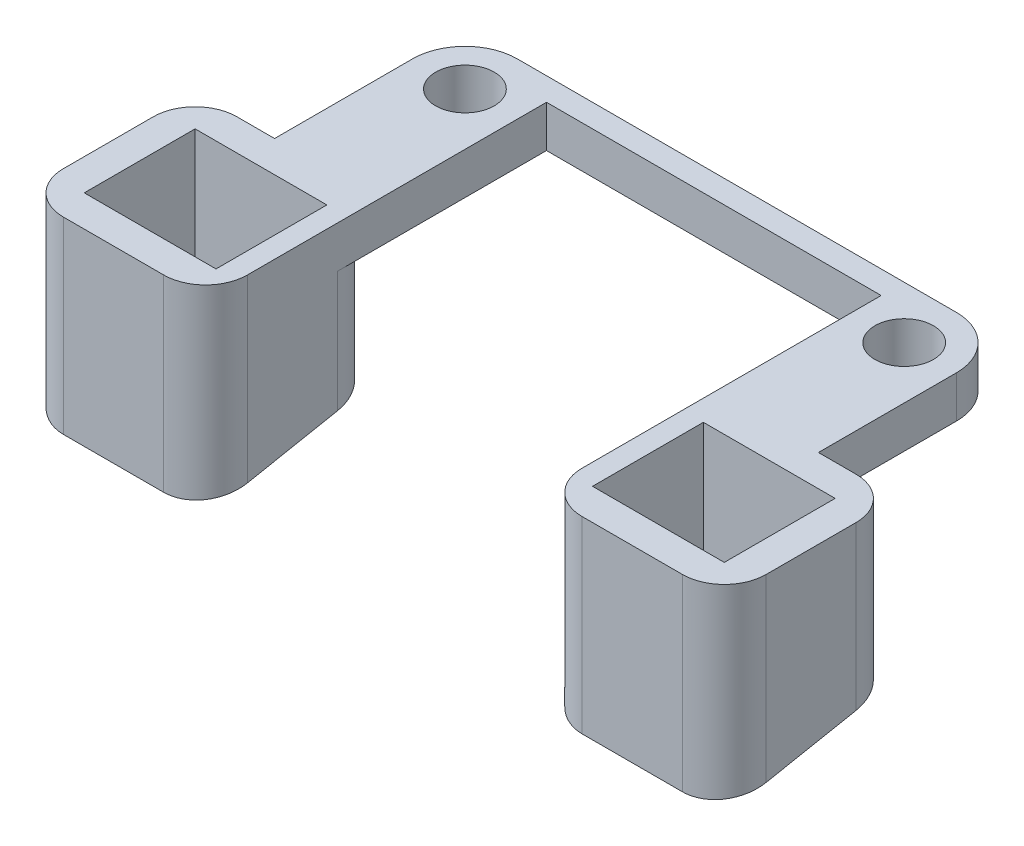
ISO-10303-21;
HEADER;
FILE_DESCRIPTION(('STEP AP214'),'2;1');
FILE_NAME('part.step','',(''),(''),'','','');
FILE_SCHEMA(('AUTOMOTIVE_DESIGN { 1 0 10303 214 1 1 1 1 }'));
ENDSEC;
DATA;
#1=APPLICATION_CONTEXT('core data for automotive mechanical design processes');
#2=APPLICATION_PROTOCOL_DEFINITION('international standard','automotive_design',2000,#1);
#3=PRODUCT_CONTEXT('',#1,'mechanical');
#4=PRODUCT('Part','Part','',(#3));
#5=PRODUCT_RELATED_PRODUCT_CATEGORY('part','',(#4));
#6=PRODUCT_DEFINITION_FORMATION('','',#4);
#7=PRODUCT_DEFINITION_CONTEXT('part definition',#1,'design');
#8=PRODUCT_DEFINITION('design','',#6,#7);
#9=PRODUCT_DEFINITION_SHAPE('','',#8);
#10=(LENGTH_UNIT() NAMED_UNIT(*) SI_UNIT(.MILLI.,.METRE.));
#11=(NAMED_UNIT(*) PLANE_ANGLE_UNIT() SI_UNIT($,.RADIAN.));
#12=(NAMED_UNIT(*) SI_UNIT($,.STERADIAN.) SOLID_ANGLE_UNIT());
#13=UNCERTAINTY_MEASURE_WITH_UNIT(LENGTH_MEASURE(1.E-05),#10,'distance_accuracy_value','');
#14=(GEOMETRIC_REPRESENTATION_CONTEXT(3) GLOBAL_UNCERTAINTY_ASSIGNED_CONTEXT((#13)) GLOBAL_UNIT_ASSIGNED_CONTEXT((#10,
#11,#12)) REPRESENTATION_CONTEXT('',''));
#15=CARTESIAN_POINT('',(0.,0.,0.));
#16=DIRECTION('',(0.,0.,1.));
#17=DIRECTION('',(1.,0.,0.));
#18=AXIS2_PLACEMENT_3D('',#15,#16,#17);
#19=CARTESIAN_POINT('',(13.,2.,0.));
#20=DIRECTION('',(0.,0.,-1.));
#21=DIRECTION('',(-1.,0.,0.));
#22=AXIS2_PLACEMENT_3D('',#19,#20,#21);
#23=PLANE('',#22);
#24=DIRECTION('',(-1.,0.,0.));
#25=VECTOR('',#24,1.);
#26=CARTESIAN_POINT('',(13.,-5.68096385542169,0.));
#27=LINE('',#26,#25);
#28=CARTESIAN_POINT('',(15.3,-5.68096385542169,0.));
#29=VERTEX_POINT('',#28);
#30=CARTESIAN_POINT('',(9.,-5.68096385542169,0.));
#31=VERTEX_POINT('',#30);
#32=EDGE_CURVE('E277',#29,#31,#27,.T.);
#33=ORIENTED_EDGE('',*,*,#32,.F.);
#34=DIRECTION('',(0.,1.,0.));
#35=VECTOR('',#34,1.);
#36=CARTESIAN_POINT('',(15.3,-7.,0.));
#37=LINE('',#36,#35);
#38=CARTESIAN_POINT('',(15.3,2.,0.));
#39=VERTEX_POINT('',#38);
#40=EDGE_CURVE('E431',#29,#39,#37,.T.);
#41=ORIENTED_EDGE('',*,*,#40,.T.);
#42=DIRECTION('',(1.,0.,0.));
#43=VECTOR('',#42,1.);
#44=CARTESIAN_POINT('',(13.,2.,0.));
#45=LINE('',#44,#43);
#46=CARTESIAN_POINT('',(9.,2.,0.));
#47=VERTEX_POINT('',#46);
#48=EDGE_CURVE('E531',#47,#39,#45,.T.);
#49=ORIENTED_EDGE('',*,*,#48,.F.);
#50=DIRECTION('',(0.,1.,0.));
#51=VECTOR('',#50,1.);
#52=CARTESIAN_POINT('',(9.,-7.,0.));
#53=LINE('',#52,#51);
#54=EDGE_CURVE('E262',#31,#47,#53,.T.);
#55=ORIENTED_EDGE('',*,*,#54,.F.);
#56=EDGE_LOOP('',(#33,#41,#49,#55));
#57=FACE_BOUND('',#56,.T.);
#58=ADVANCED_FACE('F39',(#57),#23,.F.);
#59=CARTESIAN_POINT('',(-8.,2.,0.));
#60=DIRECTION('',(0.,0.,-1.));
#61=DIRECTION('',(-1.,0.,0.));
#62=AXIS2_PLACEMENT_3D('',#59,#60,#61);
#63=PLANE('',#62);
#64=DIRECTION('',(-1.,0.,0.));
#65=VECTOR('',#64,1.);
#66=CARTESIAN_POINT('',(-8.,-5.68096385542169,0.));
#67=LINE('',#66,#65);
#68=CARTESIAN_POINT('',(-9.,-5.68096385542169,0.));
#69=VERTEX_POINT('',#68);
#70=CARTESIAN_POINT('',(-15.3,-5.68096385542169,0.));
#71=VERTEX_POINT('',#70);
#72=EDGE_CURVE('E411',#69,#71,#67,.T.);
#73=ORIENTED_EDGE('',*,*,#72,.F.);
#74=DIRECTION('',(0.,1.,0.));
#75=VECTOR('',#74,1.);
#76=CARTESIAN_POINT('',(-9.,-7.,0.));
#77=LINE('',#76,#75);
#78=CARTESIAN_POINT('',(-9.,2.,0.));
#79=VERTEX_POINT('',#78);
#80=EDGE_CURVE('E472',#69,#79,#77,.T.);
#81=ORIENTED_EDGE('',*,*,#80,.T.);
#82=DIRECTION('',(1.,0.,0.));
#83=VECTOR('',#82,1.);
#84=CARTESIAN_POINT('',(-8.,2.,0.));
#85=LINE('',#84,#83);
#86=CARTESIAN_POINT('',(-15.3,2.,0.));
#87=VERTEX_POINT('',#86);
#88=EDGE_CURVE('E516',#87,#79,#85,.T.);
#89=ORIENTED_EDGE('',*,*,#88,.F.);
#90=DIRECTION('',(0.,1.,0.));
#91=VECTOR('',#90,1.);
#92=CARTESIAN_POINT('',(-15.3,-7.,0.));
#93=LINE('',#92,#91);
#94=EDGE_CURVE('E468',#71,#87,#93,.T.);
#95=ORIENTED_EDGE('',*,*,#94,.F.);
#96=EDGE_LOOP('',(#73,#81,#89,#95));
#97=FACE_BOUND('',#96,.T.);
#98=ADVANCED_FACE('F677',(#97),#63,.F.);
#99=CARTESIAN_POINT('',(-8.,2.,-9.5));
#100=DIRECTION('',(-1.,0.,0.));
#101=DIRECTION('',(0.,0.,1.));
#102=AXIS2_PLACEMENT_3D('',#99,#100,#101);
#103=PLANE('',#102);
#104=DIRECTION('',(0.,-0.190426429595575,0.98170146934365));
#105=VECTOR('',#104,1.);
#106=CARTESIAN_POINT('',(-8.,-3.62648691070912,-10.5914028826797));
#107=LINE('',#106,#105);
#108=CARTESIAN_POINT('',(-8.,-5.77795180722892,0.5));
#109=VERTEX_POINT('',#108);
#110=CARTESIAN_POINT('',(-8.,-6.61204819277108,4.8));
#111=VERTEX_POINT('',#110);
#112=EDGE_CURVE('E410',#109,#111,#107,.T.);
#113=ORIENTED_EDGE('',*,*,#112,.F.);
#114=DIRECTION('',(0.,1.,0.));
#115=VECTOR('',#114,1.);
#116=CARTESIAN_POINT('',(-8.,0.,0.5));
#117=LINE('',#116,#115);
#118=CARTESIAN_POINT('',(-8.,0.,0.5));
#119=VERTEX_POINT('',#118);
#120=EDGE_CURVE('E348',#109,#119,#117,.T.);
#121=ORIENTED_EDGE('',*,*,#120,.T.);
#122=DIRECTION('',(0.,0.,-1.));
#123=VECTOR('',#122,1.);
#124=CARTESIAN_POINT('',(-8.,0.,-9.5));
#125=LINE('',#124,#123);
#126=CARTESIAN_POINT('',(-8.,0.,-9.5));
#127=VERTEX_POINT('',#126);
#128=EDGE_CURVE('E512',#119,#127,#125,.T.);
#129=ORIENTED_EDGE('',*,*,#128,.T.);
#130=DIRECTION('',(0.,-1.,0.));
#131=VECTOR('',#130,1.);
#132=CARTESIAN_POINT('',(-8.,2.,-9.5));
#133=LINE('',#132,#131);
#134=CARTESIAN_POINT('',(-8.,2.,-9.5));
#135=VERTEX_POINT('',#134);
#136=EDGE_CURVE('E566',#135,#127,#133,.T.);
#137=ORIENTED_EDGE('',*,*,#136,.F.);
#138=DIRECTION('',(0.,0.,-1.));
#139=VECTOR('',#138,1.);
#140=CARTESIAN_POINT('',(-8.,2.,-9.5));
#141=LINE('',#140,#139);
#142=CARTESIAN_POINT('',(-8.,2.,4.8));
#143=VERTEX_POINT('',#142);
#144=EDGE_CURVE('E520',#143,#135,#141,.T.);
#145=ORIENTED_EDGE('',*,*,#144,.F.);
#146=DIRECTION('',(0.,1.,0.));
#147=VECTOR('',#146,1.);
#148=CARTESIAN_POINT('',(-8.,-7.,4.8));
#149=LINE('',#148,#147);
#150=EDGE_CURVE('E345',#143,#111,#149,.F.);
#151=ORIENTED_EDGE('',*,*,#150,.T.);
#152=EDGE_LOOP('',(#113,#121,#129,#137,#145,#151));
#153=FACE_BOUND('',#152,.T.);
#154=ADVANCED_FACE('F628',(#153),#103,.F.);
#155=CARTESIAN_POINT('',(8.,2.,0.));
#156=DIRECTION('',(1.,0.,0.));
#157=DIRECTION('',(0.,0.,-1.));
#158=AXIS2_PLACEMENT_3D('',#155,#156,#157);
#159=PLANE('',#158);
#160=DIRECTION('',(0.,0.190426429595575,-0.98170146934365));
#161=VECTOR('',#160,1.);
#162=CARTESIAN_POINT('',(8.,-5.40243501519961,-1.43589402102065));
#163=LINE('',#162,#161);
#164=CARTESIAN_POINT('',(8.,-6.61204819277108,4.8));
#165=VERTEX_POINT('',#164);
#166=CARTESIAN_POINT('',(8.,-5.77795180722892,0.5));
#167=VERTEX_POINT('',#166);
#168=EDGE_CURVE('E402',#165,#167,#163,.T.);
#169=ORIENTED_EDGE('',*,*,#168,.F.);
#170=DIRECTION('',(0.,1.,0.));
#171=VECTOR('',#170,1.);
#172=CARTESIAN_POINT('',(8.,2.,4.8));
#173=LINE('',#172,#171);
#174=CARTESIAN_POINT('',(8.,2.,4.8));
#175=VERTEX_POINT('',#174);
#176=EDGE_CURVE('E341',#165,#175,#173,.T.);
#177=ORIENTED_EDGE('',*,*,#176,.T.);
#178=DIRECTION('',(0.,0.,1.));
#179=VECTOR('',#178,1.);
#180=CARTESIAN_POINT('',(8.,2.,0.));
#181=LINE('',#180,#179);
#182=CARTESIAN_POINT('',(8.,2.,-9.5));
#183=VERTEX_POINT('',#182);
#184=EDGE_CURVE('E527',#183,#175,#181,.T.);
#185=ORIENTED_EDGE('',*,*,#184,.F.);
#186=DIRECTION('',(0.,-1.,0.));
#187=VECTOR('',#186,1.);
#188=CARTESIAN_POINT('',(8.,2.,-9.5));
#189=LINE('',#188,#187);
#190=CARTESIAN_POINT('',(8.,0.,-9.5));
#191=VERTEX_POINT('',#190);
#192=EDGE_CURVE('E546',#183,#191,#189,.T.);
#193=ORIENTED_EDGE('',*,*,#192,.T.);
#194=DIRECTION('',(0.,0.,1.));
#195=VECTOR('',#194,1.);
#196=CARTESIAN_POINT('',(8.,0.,0.));
#197=LINE('',#196,#195);
#198=CARTESIAN_POINT('',(8.,0.,0.5));
#199=VERTEX_POINT('',#198);
#200=EDGE_CURVE('E391',#191,#199,#197,.T.);
#201=ORIENTED_EDGE('',*,*,#200,.T.);
#202=DIRECTION('',(0.,1.,0.));
#203=VECTOR('',#202,1.);
#204=CARTESIAN_POINT('',(8.,-5.39,0.5));
#205=LINE('',#204,#203);
#206=EDGE_CURVE('E338',#199,#167,#205,.F.);
#207=ORIENTED_EDGE('',*,*,#206,.T.);
#208=EDGE_LOOP('',(#169,#177,#185,#193,#201,#207));
#209=FACE_BOUND('',#208,.T.);
#210=ADVANCED_FACE('F401',(#209),#159,.F.);
#211=CARTESIAN_POINT('',(-16.8,-7.,-1.5));
#212=DIRECTION('',(-1.,0.,0.));
#213=DIRECTION('',(0.,0.,1.));
#214=AXIS2_PLACEMENT_3D('',#211,#212,#213);
#215=PLANE('',#214);
#216=DIRECTION('',(0.,0.190426429595575,-0.98170146934365));
#217=VECTOR('',#216,1.);
#218=CARTESIAN_POINT('',(-16.8,-7.,6.8));
#219=LINE('',#218,#217);
#220=CARTESIAN_POINT('',(-16.8,-6.61204819277108,4.8));
#221=VERTEX_POINT('',#220);
#222=CARTESIAN_POINT('',(-16.8,-5.77795180722892,0.5));
#223=VERTEX_POINT('',#222);
#224=EDGE_CURVE('E643',#221,#223,#219,.T.);
#225=ORIENTED_EDGE('',*,*,#224,.F.);
#226=DIRECTION('',(0.,1.,0.));
#227=VECTOR('',#226,1.);
#228=CARTESIAN_POINT('',(-16.8,-7.,4.8));
#229=LINE('',#228,#227);
#230=CARTESIAN_POINT('',(-16.8,2.,4.8));
#231=VERTEX_POINT('',#230);
#232=EDGE_CURVE('E379',#221,#231,#229,.T.);
#233=ORIENTED_EDGE('',*,*,#232,.T.);
#234=DIRECTION('',(0.,0.,1.));
#235=VECTOR('',#234,1.);
#236=CARTESIAN_POINT('',(-16.8,2.,-1.5));
#237=LINE('',#236,#235);
#238=CARTESIAN_POINT('',(-16.8,2.,0.5));
#239=VERTEX_POINT('',#238);
#240=EDGE_CURVE('E471',#239,#231,#237,.T.);
#241=ORIENTED_EDGE('',*,*,#240,.F.);
#242=DIRECTION('',(0.,1.,0.));
#243=VECTOR('',#242,1.);
#244=CARTESIAN_POINT('',(-16.8,-7.,0.5));
#245=LINE('',#244,#243);
#246=EDGE_CURVE('E55',#239,#223,#245,.F.);
#247=ORIENTED_EDGE('',*,*,#246,.T.);
#248=EDGE_LOOP('',(#225,#233,#241,#247));
#249=FACE_BOUND('',#248,.T.);
#250=ADVANCED_FACE('F642',(#249),#215,.T.);
#251=CARTESIAN_POINT('',(-16.8,-7.,-1.5));
#252=DIRECTION('',(0.,0.,-1.));
#253=DIRECTION('',(-1.,0.,0.));
#254=AXIS2_PLACEMENT_3D('',#251,#252,#253);
#255=PLANE('',#254);
#256=DIRECTION('',(1.,0.,0.));
#257=VECTOR('',#256,1.);
#258=CARTESIAN_POINT('',(0.,0.,-1.5));
#259=LINE('',#258,#257);
#260=CARTESIAN_POINT('',(-13.,0.,-1.5));
#261=VERTEX_POINT('',#260);
#262=CARTESIAN_POINT('',(-10.,0.,-1.5));
#263=VERTEX_POINT('',#262);
#264=EDGE_CURVE('E484',#261,#263,#259,.T.);
#265=ORIENTED_EDGE('',*,*,#264,.T.);
#266=DIRECTION('',(0.,1.,0.));
#267=VECTOR('',#266,1.);
#268=CARTESIAN_POINT('',(-10.,-5.39,-1.5));
#269=LINE('',#268,#267);
#270=CARTESIAN_POINT('',(-10.,-5.39,-1.5));
#271=VERTEX_POINT('',#270);
#272=EDGE_CURVE('E356',#263,#271,#269,.F.);
#273=ORIENTED_EDGE('',*,*,#272,.T.);
#274=DIRECTION('',(1.,0.,0.));
#275=VECTOR('',#274,1.);
#276=CARTESIAN_POINT('',(-16.8,-5.39,-1.5));
#277=LINE('',#276,#275);
#278=CARTESIAN_POINT('',(-14.8,-5.39,-1.5));
#279=VERTEX_POINT('',#278);
#280=EDGE_CURVE('E272',#279,#271,#277,.T.);
#281=ORIENTED_EDGE('',*,*,#280,.F.);
#282=DIRECTION('',(0.,1.,0.));
#283=VECTOR('',#282,1.);
#284=CARTESIAN_POINT('',(-14.8,-7.,-1.5));
#285=LINE('',#284,#283);
#286=CARTESIAN_POINT('',(-14.8,2.,-1.5));
#287=VERTEX_POINT('',#286);
#288=EDGE_CURVE('E352',#279,#287,#285,.T.);
#289=ORIENTED_EDGE('',*,*,#288,.T.);
#290=DIRECTION('',(-1.,0.,0.));
#291=VECTOR('',#290,1.);
#292=CARTESIAN_POINT('',(-16.8,2.,-1.5));
#293=LINE('',#292,#291);
#294=CARTESIAN_POINT('',(-13.,2.,-1.5));
#295=VERTEX_POINT('',#294);
#296=EDGE_CURVE('E485',#295,#287,#293,.T.);
#297=ORIENTED_EDGE('',*,*,#296,.F.);
#298=DIRECTION('',(0.,1.,0.));
#299=VECTOR('',#298,1.);
#300=CARTESIAN_POINT('',(-13.,2.,-1.5));
#301=LINE('',#300,#299);
#302=EDGE_CURVE('E287',#261,#295,#301,.T.);
#303=ORIENTED_EDGE('',*,*,#302,.F.);
#304=EDGE_LOOP('',(#265,#273,#281,#289,#297,#303));
#305=FACE_BOUND('',#304,.T.);
#306=ADVANCED_FACE('F617',(#305),#255,.T.);
#307=CARTESIAN_POINT('',(-15.3,-7.,0.));
#308=DIRECTION('',(-1.,0.,0.));
#309=DIRECTION('',(0.,0.,1.));
#310=AXIS2_PLACEMENT_3D('',#307,#308,#309);
#311=PLANE('',#310);
#312=DIRECTION('',(0.,-0.190426429595575,0.98170146934365));
#313=VECTOR('',#312,1.);
#314=CARTESIAN_POINT('',(-15.3,-5.72879504099628,0.246583130601927));
#315=LINE('',#314,#313);
#316=CARTESIAN_POINT('',(-15.3,-6.70903614457831,5.3));
#317=VERTEX_POINT('',#316);
#318=EDGE_CURVE('E418',#71,#317,#315,.T.);
#319=ORIENTED_EDGE('',*,*,#318,.F.);
#320=ORIENTED_EDGE('',*,*,#94,.T.);
#321=DIRECTION('',(0.,0.,1.));
#322=VECTOR('',#321,1.);
#323=CARTESIAN_POINT('',(-15.3,2.,0.));
#324=LINE('',#323,#322);
#325=CARTESIAN_POINT('',(-15.3,2.,5.3));
#326=VERTEX_POINT('',#325);
#327=EDGE_CURVE('E455',#87,#326,#324,.T.);
#328=ORIENTED_EDGE('',*,*,#327,.T.);
#329=DIRECTION('',(0.,1.,0.));
#330=VECTOR('',#329,1.);
#331=CARTESIAN_POINT('',(-15.3,-7.,5.3));
#332=LINE('',#331,#330);
#333=EDGE_CURVE('E467',#317,#326,#332,.T.);
#334=ORIENTED_EDGE('',*,*,#333,.F.);
#335=EDGE_LOOP('',(#319,#320,#328,#334));
#336=FACE_BOUND('',#335,.T.);
#337=ADVANCED_FACE('F674',(#336),#311,.F.);
#338=CARTESIAN_POINT('',(-9.,-7.,0.));
#339=DIRECTION('',(1.,0.,0.));
#340=DIRECTION('',(0.,0.,-1.));
#341=AXIS2_PLACEMENT_3D('',#338,#339,#340);
#342=PLANE('',#341);
#343=DIRECTION('',(0.,0.190426429595575,-0.98170146934365));
#344=VECTOR('',#343,1.);
#345=CARTESIAN_POINT('',(-9.,-5.72879504099628,0.246583130601927));
#346=LINE('',#345,#344);
#347=CARTESIAN_POINT('',(-9.,-6.70903614457831,5.3));
#348=VERTEX_POINT('',#347);
#349=EDGE_CURVE('E665',#348,#69,#346,.T.);
#350=ORIENTED_EDGE('',*,*,#349,.F.);
#351=DIRECTION('',(0.,1.,0.));
#352=VECTOR('',#351,1.);
#353=CARTESIAN_POINT('',(-9.,-7.,5.3));
#354=LINE('',#353,#352);
#355=CARTESIAN_POINT('',(-9.,2.,5.3));
#356=VERTEX_POINT('',#355);
#357=EDGE_CURVE('E475',#348,#356,#354,.T.);
#358=ORIENTED_EDGE('',*,*,#357,.T.);
#359=DIRECTION('',(0.,0.,-1.));
#360=VECTOR('',#359,1.);
#361=CARTESIAN_POINT('',(-9.,2.,0.));
#362=LINE('',#361,#360);
#363=EDGE_CURVE('E463',#356,#79,#362,.T.);
#364=ORIENTED_EDGE('',*,*,#363,.T.);
#365=ORIENTED_EDGE('',*,*,#80,.F.);
#366=EDGE_LOOP('',(#350,#358,#364,#365));
#367=FACE_BOUND('',#366,.T.);
#368=ADVANCED_FACE('F688',(#367),#342,.F.);
#369=CARTESIAN_POINT('',(-15.3,-7.,5.3));
#370=DIRECTION('',(0.,0.,1.));
#371=DIRECTION('',(1.,0.,0.));
#372=AXIS2_PLACEMENT_3D('',#369,#370,#371);
#373=PLANE('',#372);
#374=DIRECTION('',(1.,0.,0.));
#375=VECTOR('',#374,1.);
#376=CARTESIAN_POINT('',(-15.3,-6.70903614457831,5.3));
#377=LINE('',#376,#375);
#378=EDGE_CURVE('E661',#317,#348,#377,.T.);
#379=ORIENTED_EDGE('',*,*,#378,.F.);
#380=ORIENTED_EDGE('',*,*,#333,.T.);
#381=DIRECTION('',(1.,0.,0.));
#382=VECTOR('',#381,1.);
#383=CARTESIAN_POINT('',(-15.3,2.,5.3));
#384=LINE('',#383,#382);
#385=EDGE_CURVE('E459',#326,#356,#384,.T.);
#386=ORIENTED_EDGE('',*,*,#385,.T.);
#387=ORIENTED_EDGE('',*,*,#357,.F.);
#388=EDGE_LOOP('',(#379,#380,#386,#387));
#389=FACE_BOUND('',#388,.T.);
#390=ADVANCED_FACE('F685',(#389),#373,.F.);
#391=CARTESIAN_POINT('',(16.8,-7.,-1.5));
#392=DIRECTION('',(0.,0.,-1.));
#393=DIRECTION('',(-1.,0.,0.));
#394=AXIS2_PLACEMENT_3D('',#391,#392,#393);
#395=PLANE('',#394);
#396=DIRECTION('',(-1.,0.,0.));
#397=VECTOR('',#396,1.);
#398=CARTESIAN_POINT('',(16.8,2.,-1.5));
#399=LINE('',#398,#397);
#400=CARTESIAN_POINT('',(14.8,2.,-1.5));
#401=VERTEX_POINT('',#400);
#402=CARTESIAN_POINT('',(13.,2.,-1.5));
#403=VERTEX_POINT('',#402);
#404=EDGE_CURVE('E434',#401,#403,#399,.T.);
#405=ORIENTED_EDGE('',*,*,#404,.F.);
#406=DIRECTION('',(0.,1.,0.));
#407=VECTOR('',#406,1.);
#408=CARTESIAN_POINT('',(14.8,-7.,-1.5));
#409=LINE('',#408,#407);
#410=CARTESIAN_POINT('',(14.8,-5.39,-1.5));
#411=VERTEX_POINT('',#410);
#412=EDGE_CURVE('E316',#401,#411,#409,.F.);
#413=ORIENTED_EDGE('',*,*,#412,.T.);
#414=CARTESIAN_POINT('',(10.,-5.39,-1.5));
#415=VERTEX_POINT('',#414);
#416=EDGE_CURVE('E648',#415,#411,#277,.T.);
#417=ORIENTED_EDGE('',*,*,#416,.F.);
#418=DIRECTION('',(0.,1.,0.));
#419=VECTOR('',#418,1.);
#420=CARTESIAN_POINT('',(10.,0.,-1.5));
#421=LINE('',#420,#419);
#422=CARTESIAN_POINT('',(10.,0.,-1.5));
#423=VERTEX_POINT('',#422);
#424=EDGE_CURVE('E312',#415,#423,#421,.T.);
#425=ORIENTED_EDGE('',*,*,#424,.T.);
#426=DIRECTION('',(1.,0.,0.));
#427=VECTOR('',#426,1.);
#428=CARTESIAN_POINT('',(0.,0.,-1.5));
#429=LINE('',#428,#427);
#430=CARTESIAN_POINT('',(13.,0.,-1.5));
#431=VERTEX_POINT('',#430);
#432=EDGE_CURVE('E393',#423,#431,#429,.T.);
#433=ORIENTED_EDGE('',*,*,#432,.T.);
#434=DIRECTION('',(0.,-1.,0.));
#435=VECTOR('',#434,1.);
#436=CARTESIAN_POINT('',(13.,2.,-1.5));
#437=LINE('',#436,#435);
#438=EDGE_CURVE('E280',#403,#431,#437,.T.);
#439=ORIENTED_EDGE('',*,*,#438,.F.);
#440=EDGE_LOOP('',(#405,#413,#417,#425,#433,#439));
#441=FACE_BOUND('',#440,.T.);
#442=ADVANCED_FACE('F695',(#441),#395,.T.);
#443=CARTESIAN_POINT('',(16.8,-7.,-1.5));
#444=DIRECTION('',(1.,0.,0.));
#445=DIRECTION('',(0.,0.,-1.));
#446=AXIS2_PLACEMENT_3D('',#443,#444,#445);
#447=PLANE('',#446);
#448=DIRECTION('',(0.,0.190426429595575,-0.98170146934365));
#449=VECTOR('',#448,1.);
#450=CARTESIAN_POINT('',(16.8,-5.44838218239251,-1.1990235317653));
#451=LINE('',#450,#449);
#452=CARTESIAN_POINT('',(16.8,-6.61204819277108,4.8));
#453=VERTEX_POINT('',#452);
#454=CARTESIAN_POINT('',(16.8,-5.77795180722892,0.5));
#455=VERTEX_POINT('',#454);
#456=EDGE_CURVE('E657',#453,#455,#451,.T.);
#457=ORIENTED_EDGE('',*,*,#456,.T.);
#458=DIRECTION('',(0.,1.,0.));
#459=VECTOR('',#458,1.);
#460=CARTESIAN_POINT('',(16.8,-7.,0.5));
#461=LINE('',#460,#459);
#462=CARTESIAN_POINT('',(16.8,2.,0.5));
#463=VERTEX_POINT('',#462);
#464=EDGE_CURVE('E284',#455,#463,#461,.T.);
#465=ORIENTED_EDGE('',*,*,#464,.T.);
#466=DIRECTION('',(0.,0.,-1.));
#467=VECTOR('',#466,1.);
#468=CARTESIAN_POINT('',(16.8,2.,-1.5));
#469=LINE('',#468,#467);
#470=CARTESIAN_POINT('',(16.8,2.,4.8));
#471=VERTEX_POINT('',#470);
#472=EDGE_CURVE('E443',#471,#463,#469,.T.);
#473=ORIENTED_EDGE('',*,*,#472,.F.);
#474=DIRECTION('',(0.,1.,0.));
#475=VECTOR('',#474,1.);
#476=CARTESIAN_POINT('',(16.8,-7.,4.8));
#477=LINE('',#476,#475);
#478=EDGE_CURVE('E279',#471,#453,#477,.F.);
#479=ORIENTED_EDGE('',*,*,#478,.T.);
#480=EDGE_LOOP('',(#457,#465,#473,#479));
#481=FACE_BOUND('',#480,.T.);
#482=ADVANCED_FACE('F848',(#481),#447,.T.);
#483=CARTESIAN_POINT('',(15.3,-7.,0.));
#484=DIRECTION('',(1.,0.,0.));
#485=DIRECTION('',(0.,0.,-1.));
#486=AXIS2_PLACEMENT_3D('',#483,#484,#485);
#487=PLANE('',#486);
#488=DIRECTION('',(0.,0.190426429595575,-0.98170146934365));
#489=VECTOR('',#488,1.);
#490=CARTESIAN_POINT('',(15.3,-5.72879504099628,0.246583130601927));
#491=LINE('',#490,#489);
#492=CARTESIAN_POINT('',(15.3,-6.70903614457831,5.3));
#493=VERTEX_POINT('',#492);
#494=EDGE_CURVE('E271',#493,#29,#491,.T.);
#495=ORIENTED_EDGE('',*,*,#494,.F.);
#496=DIRECTION('',(0.,1.,0.));
#497=VECTOR('',#496,1.);
#498=CARTESIAN_POINT('',(15.3,-7.,5.3));
#499=LINE('',#498,#497);
#500=CARTESIAN_POINT('',(15.3,2.,5.3));
#501=VERTEX_POINT('',#500);
#502=EDGE_CURVE('E261',#493,#501,#499,.T.);
#503=ORIENTED_EDGE('',*,*,#502,.T.);
#504=DIRECTION('',(0.,0.,-1.));
#505=VECTOR('',#504,1.);
#506=CARTESIAN_POINT('',(15.3,2.,0.));
#507=LINE('',#506,#505);
#508=EDGE_CURVE('E427',#501,#39,#507,.T.);
#509=ORIENTED_EDGE('',*,*,#508,.T.);
#510=ORIENTED_EDGE('',*,*,#40,.F.);
#511=EDGE_LOOP('',(#495,#503,#509,#510));
#512=FACE_BOUND('',#511,.T.);
#513=ADVANCED_FACE('F853',(#512),#487,.F.);
#514=CARTESIAN_POINT('',(15.3,-7.,5.3));
#515=DIRECTION('',(0.,0.,1.));
#516=DIRECTION('',(1.,0.,0.));
#517=AXIS2_PLACEMENT_3D('',#514,#515,#516);
#518=PLANE('',#517);
#519=DIRECTION('',(1.,0.,0.));
#520=VECTOR('',#519,1.);
#521=CARTESIAN_POINT('',(15.3,-6.70903614457831,5.3));
#522=LINE('',#521,#520);
#523=CARTESIAN_POINT('',(9.,-6.70903614457831,5.3));
#524=VERTEX_POINT('',#523);
#525=EDGE_CURVE('E266',#524,#493,#522,.T.);
#526=ORIENTED_EDGE('',*,*,#525,.F.);
#527=DIRECTION('',(0.,1.,0.));
#528=VECTOR('',#527,1.);
#529=CARTESIAN_POINT('',(9.,-7.,5.3));
#530=LINE('',#529,#528);
#531=CARTESIAN_POINT('',(9.,2.,5.3));
#532=VERTEX_POINT('',#531);
#533=EDGE_CURVE('E249',#524,#532,#530,.T.);
#534=ORIENTED_EDGE('',*,*,#533,.T.);
#535=DIRECTION('',(1.,0.,0.));
#536=VECTOR('',#535,1.);
#537=CARTESIAN_POINT('',(15.3,2.,5.3));
#538=LINE('',#537,#536);
#539=EDGE_CURVE('E424',#532,#501,#538,.T.);
#540=ORIENTED_EDGE('',*,*,#539,.T.);
#541=ORIENTED_EDGE('',*,*,#502,.F.);
#542=EDGE_LOOP('',(#526,#534,#540,#541));
#543=FACE_BOUND('',#542,.T.);
#544=ADVANCED_FACE('F267',(#543),#518,.F.);
#545=CARTESIAN_POINT('',(9.,-7.,0.));
#546=DIRECTION('',(-1.,0.,0.));
#547=DIRECTION('',(0.,0.,1.));
#548=AXIS2_PLACEMENT_3D('',#545,#546,#547);
#549=PLANE('',#548);
#550=DIRECTION('',(0.,-0.190426429595575,0.98170146934365));
#551=VECTOR('',#550,1.);
#552=CARTESIAN_POINT('',(9.,-5.72879504099628,0.246583130601927));
#553=LINE('',#552,#551);
#554=EDGE_CURVE('E253',#31,#524,#553,.T.);
#555=ORIENTED_EDGE('',*,*,#554,.F.);
#556=ORIENTED_EDGE('',*,*,#54,.T.);
#557=DIRECTION('',(0.,0.,1.));
#558=VECTOR('',#557,1.);
#559=CARTESIAN_POINT('',(9.,2.,0.));
#560=LINE('',#559,#558);
#561=EDGE_CURVE('E256',#47,#532,#560,.T.);
#562=ORIENTED_EDGE('',*,*,#561,.T.);
#563=ORIENTED_EDGE('',*,*,#533,.F.);
#564=EDGE_LOOP('',(#555,#556,#562,#563));
#565=FACE_BOUND('',#564,.T.);
#566=ADVANCED_FACE('F251',(#565),#549,.F.);
#567=CARTESIAN_POINT('',(0.,2.,0.));
#568=DIRECTION('',(0.,-1.,0.));
#569=DIRECTION('',(0.,0.,-1.));
#570=AXIS2_PLACEMENT_3D('',#567,#568,#569);
#571=PLANE('',#570);
#572=ORIENTED_EDGE('',*,*,#472,.T.);
#573=CARTESIAN_POINT('',(14.8,2.,0.5));
#574=DIRECTION('',(0.,-1.,0.));
#575=DIRECTION('',(0.,0.,-1.));
#576=AXIS2_PLACEMENT_3D('',#573,#574,#575);
#577=CIRCLE('',#576,2.);
#578=EDGE_CURVE('E309',#463,#401,#577,.F.);
#579=ORIENTED_EDGE('',*,*,#578,.T.);
#580=ORIENTED_EDGE('',*,*,#404,.T.);
#581=DIRECTION('',(0.,0.,-1.));
#582=VECTOR('',#581,1.);
#583=CARTESIAN_POINT('',(13.,2.,-10.6));
#584=LINE('',#583,#582);
#585=CARTESIAN_POINT('',(13.,2.,-8.1));
#586=VERTEX_POINT('',#585);
#587=EDGE_CURVE('E535',#403,#586,#584,.T.);
#588=ORIENTED_EDGE('',*,*,#587,.T.);
#589=CARTESIAN_POINT('',(10.5,2.,-8.1));
#590=DIRECTION('',(0.,-1.,0.));
#591=DIRECTION('',(0.,0.,-1.));
#592=AXIS2_PLACEMENT_3D('',#589,#590,#591);
#593=CIRCLE('',#592,2.5);
#594=CARTESIAN_POINT('',(10.5,2.,-10.6));
#595=VERTEX_POINT('',#594);
#596=EDGE_CURVE('E591',#586,#595,#593,.F.);
#597=ORIENTED_EDGE('',*,*,#596,.T.);
#598=DIRECTION('',(-1.,0.,0.));
#599=VECTOR('',#598,1.);
#600=CARTESIAN_POINT('',(-13.,2.,-10.6));
#601=LINE('',#600,#599);
#602=CARTESIAN_POINT('',(-10.5,2.,-10.6));
#603=VERTEX_POINT('',#602);
#604=EDGE_CURVE('E538',#595,#603,#601,.T.);
#605=ORIENTED_EDGE('',*,*,#604,.T.);
#606=CARTESIAN_POINT('',(-10.5,2.,-8.1));
#607=DIRECTION('',(0.,-1.,0.));
#608=DIRECTION('',(0.,0.,-1.));
#609=AXIS2_PLACEMENT_3D('',#606,#607,#608);
#610=CIRCLE('',#609,2.5);
#611=CARTESIAN_POINT('',(-13.,2.,-8.1));
#612=VERTEX_POINT('',#611);
#613=EDGE_CURVE('E588',#603,#612,#610,.F.);
#614=ORIENTED_EDGE('',*,*,#613,.T.);
#615=DIRECTION('',(0.,0.,1.));
#616=VECTOR('',#615,1.);
#617=CARTESIAN_POINT('',(-13.,2.,0.));
#618=LINE('',#617,#616);
#619=EDGE_CURVE('E542',#612,#295,#618,.T.);
#620=ORIENTED_EDGE('',*,*,#619,.T.);
#621=ORIENTED_EDGE('',*,*,#296,.T.);
#622=CARTESIAN_POINT('',(-14.8,2.,0.5));
#623=DIRECTION('',(0.,-1.,0.));
#624=DIRECTION('',(0.,0.,-1.));
#625=AXIS2_PLACEMENT_3D('',#622,#623,#624);
#626=CIRCLE('',#625,2.);
#627=EDGE_CURVE('E294',#287,#239,#626,.F.);
#628=ORIENTED_EDGE('',*,*,#627,.T.);
#629=ORIENTED_EDGE('',*,*,#240,.T.);
#630=CARTESIAN_POINT('',(-14.8,2.,4.8));
#631=DIRECTION('',(0.,-1.,0.));
#632=DIRECTION('',(0.,0.,-1.));
#633=AXIS2_PLACEMENT_3D('',#630,#631,#632);
#634=CIRCLE('',#633,2.);
#635=CARTESIAN_POINT('',(-14.8,2.,6.8));
#636=VERTEX_POINT('',#635);
#637=EDGE_CURVE('E297',#231,#636,#634,.F.);
#638=ORIENTED_EDGE('',*,*,#637,.T.);
#639=DIRECTION('',(1.,0.,0.));
#640=VECTOR('',#639,1.);
#641=CARTESIAN_POINT('',(-16.8,2.,6.8));
#642=LINE('',#641,#640);
#643=CARTESIAN_POINT('',(-10.,2.,6.8));
#644=VERTEX_POINT('',#643);
#645=EDGE_CURVE('E489',#636,#644,#642,.T.);
#646=ORIENTED_EDGE('',*,*,#645,.T.);
#647=CARTESIAN_POINT('',(-10.,2.,4.8));
#648=DIRECTION('',(0.,-1.,0.));
#649=DIRECTION('',(0.,0.,-1.));
#650=AXIS2_PLACEMENT_3D('',#647,#648,#649);
#651=CIRCLE('',#650,2.);
#652=EDGE_CURVE('E300',#644,#143,#651,.F.);
#653=ORIENTED_EDGE('',*,*,#652,.T.);
#654=ORIENTED_EDGE('',*,*,#144,.T.);
#655=DIRECTION('',(1.,0.,0.));
#656=VECTOR('',#655,1.);
#657=CARTESIAN_POINT('',(8.,2.,-9.5));
#658=LINE('',#657,#656);
#659=EDGE_CURVE('E524',#135,#183,#658,.T.);
#660=ORIENTED_EDGE('',*,*,#659,.T.);
#661=ORIENTED_EDGE('',*,*,#184,.T.);
#662=CARTESIAN_POINT('',(10.,2.,4.8));
#663=DIRECTION('',(0.,-1.,0.));
#664=DIRECTION('',(0.,0.,-1.));
#665=AXIS2_PLACEMENT_3D('',#662,#663,#664);
#666=CIRCLE('',#665,2.);
#667=CARTESIAN_POINT('',(10.,2.,6.8));
#668=VERTEX_POINT('',#667);
#669=EDGE_CURVE('E303',#175,#668,#666,.F.);
#670=ORIENTED_EDGE('',*,*,#669,.T.);
#671=DIRECTION('',(1.,0.,0.));
#672=VECTOR('',#671,1.);
#673=CARTESIAN_POINT('',(16.8,2.,6.8));
#674=LINE('',#673,#672);
#675=CARTESIAN_POINT('',(14.8,2.,6.8));
#676=VERTEX_POINT('',#675);
#677=EDGE_CURVE('E446',#668,#676,#674,.T.);
#678=ORIENTED_EDGE('',*,*,#677,.T.);
#679=CARTESIAN_POINT('',(14.8,2.,4.8));
#680=DIRECTION('',(0.,-1.,0.));
#681=DIRECTION('',(0.,0.,-1.));
#682=AXIS2_PLACEMENT_3D('',#679,#680,#681);
#683=CIRCLE('',#682,2.);
#684=EDGE_CURVE('E306',#676,#471,#683,.F.);
#685=ORIENTED_EDGE('',*,*,#684,.T.);
#686=EDGE_LOOP('',(#572,#579,#580,#588,#597,#605,#614,#620,#621,#628,#629,#638,#646,#653,#654,
#660,#661,#670,#678,#685));
#687=FACE_BOUND('',#686,.T.);
#688=CARTESIAN_POINT('',(-10.5,2.,-8.1));
#689=DIRECTION('',(0.,1.,0.));
#690=DIRECTION('',(0.,0.,1.));
#691=AXIS2_PLACEMENT_3D('',#688,#689,#690);
#692=CIRCLE('',#691,1.4);
#693=CARTESIAN_POINT('',(-10.5,2.,-6.7));
#694=VERTEX_POINT('',#693);
#695=EDGE_CURVE('E508',#694,#694,#692,.T.);
#696=ORIENTED_EDGE('',*,*,#695,.F.);
#697=EDGE_LOOP('',(#696));
#698=FACE_BOUND('',#697,.T.);
#699=CARTESIAN_POINT('',(10.5,2.,-8.1));
#700=DIRECTION('',(0.,1.,0.));
#701=DIRECTION('',(0.,0.,1.));
#702=AXIS2_PLACEMENT_3D('',#699,#700,#701);
#703=CIRCLE('',#702,1.4);
#704=CARTESIAN_POINT('',(10.5,2.,-6.7));
#705=VERTEX_POINT('',#704);
#706=EDGE_CURVE('E500',#705,#705,#703,.T.);
#707=ORIENTED_EDGE('',*,*,#706,.F.);
#708=EDGE_LOOP('',(#707));
#709=FACE_BOUND('',#708,.T.);
#710=ORIENTED_EDGE('',*,*,#88,.T.);
#711=ORIENTED_EDGE('',*,*,#363,.F.);
#712=ORIENTED_EDGE('',*,*,#385,.F.);
#713=ORIENTED_EDGE('',*,*,#327,.F.);
#714=EDGE_LOOP('',(#710,#711,#712,#713));
#715=FACE_BOUND('',#714,.T.);
#716=ORIENTED_EDGE('',*,*,#561,.F.);
#717=ORIENTED_EDGE('',*,*,#48,.T.);
#718=ORIENTED_EDGE('',*,*,#508,.F.);
#719=ORIENTED_EDGE('',*,*,#539,.F.);
#720=EDGE_LOOP('',(#716,#717,#718,#719));
#721=FACE_BOUND('',#720,.T.);
#722=ADVANCED_FACE('F607',(#687,#698,#709,#715,#721),#571,.F.);
#723=CARTESIAN_POINT('',(0.,0.,0.));
#724=DIRECTION('',(0.,-1.,0.));
#725=DIRECTION('',(0.,0.,-1.));
#726=AXIS2_PLACEMENT_3D('',#723,#724,#725);
#727=PLANE('',#726);
#728=ORIENTED_EDGE('',*,*,#432,.F.);
#729=CARTESIAN_POINT('',(10.,0.,0.5));
#730=DIRECTION('',(0.,-1.,0.));
#731=DIRECTION('',(0.,0.,-1.));
#732=AXIS2_PLACEMENT_3D('',#729,#730,#731);
#733=CIRCLE('',#732,2.);
#734=EDGE_CURVE('E48',#423,#199,#733,.F.);
#735=ORIENTED_EDGE('',*,*,#734,.T.);
#736=ORIENTED_EDGE('',*,*,#200,.F.);
#737=DIRECTION('',(1.,0.,0.));
#738=VECTOR('',#737,1.);
#739=CARTESIAN_POINT('',(8.,0.,-9.5));
#740=LINE('',#739,#738);
#741=EDGE_CURVE('E549',#127,#191,#740,.T.);
#742=ORIENTED_EDGE('',*,*,#741,.F.);
#743=ORIENTED_EDGE('',*,*,#128,.F.);
#744=CARTESIAN_POINT('',(-10.,0.,0.5));
#745=DIRECTION('',(0.,-1.,0.));
#746=DIRECTION('',(0.,0.,-1.));
#747=AXIS2_PLACEMENT_3D('',#744,#745,#746);
#748=CIRCLE('',#747,2.);
#749=EDGE_CURVE('E11',#119,#263,#748,.F.);
#750=ORIENTED_EDGE('',*,*,#749,.T.);
#751=ORIENTED_EDGE('',*,*,#264,.F.);
#752=DIRECTION('',(0.,0.,1.));
#753=VECTOR('',#752,1.);
#754=CARTESIAN_POINT('',(-13.,0.,0.));
#755=LINE('',#754,#753);
#756=CARTESIAN_POINT('',(-13.,0.,-8.1));
#757=VERTEX_POINT('',#756);
#758=EDGE_CURVE('E521',#757,#261,#755,.T.);
#759=ORIENTED_EDGE('',*,*,#758,.F.);
#760=CARTESIAN_POINT('',(-10.5,0.,-8.1));
#761=DIRECTION('',(0.,-1.,0.));
#762=DIRECTION('',(0.,0.,-1.));
#763=AXIS2_PLACEMENT_3D('',#760,#761,#762);
#764=CIRCLE('',#763,2.5);
#765=CARTESIAN_POINT('',(-10.5,0.,-10.6));
#766=VERTEX_POINT('',#765);
#767=EDGE_CURVE('E577',#757,#766,#764,.T.);
#768=ORIENTED_EDGE('',*,*,#767,.T.);
#769=DIRECTION('',(-1.,0.,0.));
#770=VECTOR('',#769,1.);
#771=CARTESIAN_POINT('',(-13.,0.,-10.6));
#772=LINE('',#771,#770);
#773=CARTESIAN_POINT('',(10.5,0.,-10.6));
#774=VERTEX_POINT('',#773);
#775=EDGE_CURVE('E557',#774,#766,#772,.T.);
#776=ORIENTED_EDGE('',*,*,#775,.F.);
#777=CARTESIAN_POINT('',(10.5,0.,-8.1));
#778=DIRECTION('',(0.,-1.,0.));
#779=DIRECTION('',(0.,0.,-1.));
#780=AXIS2_PLACEMENT_3D('',#777,#778,#779);
#781=CIRCLE('',#780,2.5);
#782=CARTESIAN_POINT('',(13.,0.,-8.1));
#783=VERTEX_POINT('',#782);
#784=EDGE_CURVE('E580',#774,#783,#781,.T.);
#785=ORIENTED_EDGE('',*,*,#784,.T.);
#786=DIRECTION('',(0.,0.,-1.));
#787=VECTOR('',#786,1.);
#788=CARTESIAN_POINT('',(13.,0.,-10.6));
#789=LINE('',#788,#787);
#790=EDGE_CURVE('E554',#431,#783,#789,.T.);
#791=ORIENTED_EDGE('',*,*,#790,.F.);
#792=EDGE_LOOP('',(#728,#735,#736,#742,#743,#750,#751,#759,#768,#776,#785,#791));
#793=FACE_BOUND('',#792,.T.);
#794=CARTESIAN_POINT('',(-10.5,0.,-8.1));
#795=DIRECTION('',(0.,1.,0.));
#796=DIRECTION('',(0.,0.,1.));
#797=AXIS2_PLACEMENT_3D('',#794,#795,#796);
#798=CIRCLE('',#797,1.4);
#799=CARTESIAN_POINT('',(-10.5,0.,-6.7));
#800=VERTEX_POINT('',#799);
#801=EDGE_CURVE('E504',#800,#800,#798,.T.);
#802=ORIENTED_EDGE('',*,*,#801,.T.);
#803=EDGE_LOOP('',(#802));
#804=FACE_BOUND('',#803,.T.);
#805=CARTESIAN_POINT('',(10.5,0.,-8.1));
#806=DIRECTION('',(0.,1.,0.));
#807=DIRECTION('',(0.,0.,1.));
#808=AXIS2_PLACEMENT_3D('',#805,#806,#807);
#809=CIRCLE('',#808,1.4);
#810=CARTESIAN_POINT('',(10.5,0.,-6.7));
#811=VERTEX_POINT('',#810);
#812=EDGE_CURVE('E499',#811,#811,#809,.T.);
#813=ORIENTED_EDGE('',*,*,#812,.T.);
#814=EDGE_LOOP('',(#813));
#815=FACE_BOUND('',#814,.T.);
#816=ADVANCED_FACE('F388',(#793,#804,#815),#727,.T.);
#817=CARTESIAN_POINT('',(8.,2.,-9.5));
#818=DIRECTION('',(0.,0.,-1.));
#819=DIRECTION('',(-1.,0.,0.));
#820=AXIS2_PLACEMENT_3D('',#817,#818,#819);
#821=PLANE('',#820);
#822=ORIENTED_EDGE('',*,*,#741,.T.);
#823=ORIENTED_EDGE('',*,*,#192,.F.);
#824=ORIENTED_EDGE('',*,*,#659,.F.);
#825=ORIENTED_EDGE('',*,*,#136,.T.);
#826=EDGE_LOOP('',(#822,#823,#824,#825));
#827=FACE_BOUND('',#826,.T.);
#828=ADVANCED_FACE('F712',(#827),#821,.F.);
#829=CARTESIAN_POINT('',(13.,2.,-10.6));
#830=DIRECTION('',(-1.,0.,0.));
#831=DIRECTION('',(0.,0.,1.));
#832=AXIS2_PLACEMENT_3D('',#829,#830,#831);
#833=PLANE('',#832);
#834=ORIENTED_EDGE('',*,*,#587,.F.);
#835=ORIENTED_EDGE('',*,*,#438,.T.);
#836=ORIENTED_EDGE('',*,*,#790,.T.);
#837=DIRECTION('',(0.,-1.,0.));
#838=VECTOR('',#837,1.);
#839=CARTESIAN_POINT('',(13.,2.,-8.1));
#840=LINE('',#839,#838);
#841=EDGE_CURVE('E584',#783,#586,#840,.F.);
#842=ORIENTED_EDGE('',*,*,#841,.T.);
#843=EDGE_LOOP('',(#834,#835,#836,#842));
#844=FACE_BOUND('',#843,.T.);
#845=ADVANCED_FACE('F708',(#844),#833,.F.);
#846=CARTESIAN_POINT('',(-13.,2.,-10.6));
#847=DIRECTION('',(0.,0.,1.));
#848=DIRECTION('',(1.,0.,0.));
#849=AXIS2_PLACEMENT_3D('',#846,#847,#848);
#850=PLANE('',#849);
#851=ORIENTED_EDGE('',*,*,#604,.F.);
#852=DIRECTION('',(0.,-1.,0.));
#853=VECTOR('',#852,1.);
#854=CARTESIAN_POINT('',(10.5,2.,-10.6));
#855=LINE('',#854,#853);
#856=EDGE_CURVE('E573',#595,#774,#855,.T.);
#857=ORIENTED_EDGE('',*,*,#856,.T.);
#858=ORIENTED_EDGE('',*,*,#775,.T.);
#859=DIRECTION('',(0.,-1.,0.));
#860=VECTOR('',#859,1.);
#861=CARTESIAN_POINT('',(-10.5,2.,-10.6));
#862=LINE('',#861,#860);
#863=EDGE_CURVE('E570',#766,#603,#862,.F.);
#864=ORIENTED_EDGE('',*,*,#863,.T.);
#865=EDGE_LOOP('',(#851,#857,#858,#864));
#866=FACE_BOUND('',#865,.T.);
#867=ADVANCED_FACE('F952',(#866),#850,.F.);
#868=CARTESIAN_POINT('',(-13.,2.,0.));
#869=DIRECTION('',(1.,0.,0.));
#870=DIRECTION('',(0.,0.,-1.));
#871=AXIS2_PLACEMENT_3D('',#868,#869,#870);
#872=PLANE('',#871);
#873=ORIENTED_EDGE('',*,*,#758,.T.);
#874=ORIENTED_EDGE('',*,*,#302,.T.);
#875=ORIENTED_EDGE('',*,*,#619,.F.);
#876=DIRECTION('',(0.,-1.,0.));
#877=VECTOR('',#876,1.);
#878=CARTESIAN_POINT('',(-13.,2.,-8.1));
#879=LINE('',#878,#877);
#880=EDGE_CURVE('E594',#612,#757,#879,.T.);
#881=ORIENTED_EDGE('',*,*,#880,.T.);
#882=EDGE_LOOP('',(#873,#874,#875,#881));
#883=FACE_BOUND('',#882,.T.);
#884=ADVANCED_FACE('F601',(#883),#872,.F.);
#885=CARTESIAN_POINT('',(-10.5,2.,-8.1));
#886=DIRECTION('',(0.,-1.,0.));
#887=DIRECTION('',(0.,0.,-1.));
#888=AXIS2_PLACEMENT_3D('',#885,#886,#887);
#889=CYLINDRICAL_SURFACE('',#888,1.4);
#890=ORIENTED_EDGE('',*,*,#695,.T.);
#891=EDGE_LOOP('',(#890));
#892=FACE_BOUND('',#891,.T.);
#893=ORIENTED_EDGE('',*,*,#801,.F.);
#894=EDGE_LOOP('',(#893));
#895=FACE_BOUND('',#894,.T.);
#896=ADVANCED_FACE('F951',(#892,#895),#889,.F.);
#897=CARTESIAN_POINT('',(10.5,2.,-8.1));
#898=DIRECTION('',(0.,-1.,0.));
#899=DIRECTION('',(0.,0.,-1.));
#900=AXIS2_PLACEMENT_3D('',#897,#898,#899);
#901=CYLINDRICAL_SURFACE('',#900,1.4);
#902=ORIENTED_EDGE('',*,*,#706,.T.);
#903=EDGE_LOOP('',(#902));
#904=FACE_BOUND('',#903,.T.);
#905=ORIENTED_EDGE('',*,*,#812,.F.);
#906=EDGE_LOOP('',(#905));
#907=FACE_BOUND('',#906,.T.);
#908=ADVANCED_FACE('F721',(#904,#907),#901,.F.);
#909=CARTESIAN_POINT('',(10.5,2.,-8.1));
#910=DIRECTION('',(0.,-1.,0.));
#911=DIRECTION('',(0.,0.,-1.));
#912=AXIS2_PLACEMENT_3D('',#909,#910,#911);
#913=CYLINDRICAL_SURFACE('',#912,2.5);
#914=ORIENTED_EDGE('',*,*,#596,.F.);
#915=ORIENTED_EDGE('',*,*,#841,.F.);
#916=ORIENTED_EDGE('',*,*,#784,.F.);
#917=ORIENTED_EDGE('',*,*,#856,.F.);
#918=EDGE_LOOP('',(#914,#915,#916,#917));
#919=FACE_BOUND('',#918,.T.);
#920=ADVANCED_FACE('F718',(#919),#913,.T.);
#921=CARTESIAN_POINT('',(-10.5,2.,-8.1));
#922=DIRECTION('',(0.,-1.,0.));
#923=DIRECTION('',(0.,0.,-1.));
#924=AXIS2_PLACEMENT_3D('',#921,#922,#923);
#925=CYLINDRICAL_SURFACE('',#924,2.5);
#926=ORIENTED_EDGE('',*,*,#613,.F.);
#927=ORIENTED_EDGE('',*,*,#863,.F.);
#928=ORIENTED_EDGE('',*,*,#767,.F.);
#929=ORIENTED_EDGE('',*,*,#880,.F.);
#930=EDGE_LOOP('',(#926,#927,#928,#929));
#931=FACE_BOUND('',#930,.T.);
#932=ADVANCED_FACE('F613',(#931),#925,.T.);
#933=CARTESIAN_POINT('',(-16.8,-7.,6.8));
#934=DIRECTION('',(0.,0.,1.));
#935=DIRECTION('',(1.,0.,0.));
#936=AXIS2_PLACEMENT_3D('',#933,#934,#935);
#937=PLANE('',#936);
#938=DIRECTION('',(1.,0.,0.));
#939=VECTOR('',#938,1.);
#940=CARTESIAN_POINT('',(-16.8,-7.,6.8));
#941=LINE('',#940,#939);
#942=CARTESIAN_POINT('',(-14.8,-7.,6.8));
#943=VERTEX_POINT('',#942);
#944=CARTESIAN_POINT('',(-10.,-7.,6.8));
#945=VERTEX_POINT('',#944);
#946=EDGE_CURVE('E480',#943,#945,#941,.T.);
#947=ORIENTED_EDGE('',*,*,#946,.T.);
#948=DIRECTION('',(0.,1.,0.));
#949=VECTOR('',#948,1.);
#950=CARTESIAN_POINT('',(-10.,2.,6.8));
#951=LINE('',#950,#949);
#952=EDGE_CURVE('E373',#945,#644,#951,.T.);
#953=ORIENTED_EDGE('',*,*,#952,.T.);
#954=ORIENTED_EDGE('',*,*,#645,.F.);
#955=DIRECTION('',(0.,1.,0.));
#956=VECTOR('',#955,1.);
#957=CARTESIAN_POINT('',(-14.8,-7.,6.8));
#958=LINE('',#957,#956);
#959=EDGE_CURVE('E370',#636,#943,#958,.F.);
#960=ORIENTED_EDGE('',*,*,#959,.T.);
#961=EDGE_LOOP('',(#947,#953,#954,#960));
#962=FACE_BOUND('',#961,.T.);
#963=ADVANCED_FACE('F636',(#962),#937,.T.);
#964=CARTESIAN_POINT('',(16.8,-7.,6.8));
#965=DIRECTION('',(0.,0.,1.));
#966=DIRECTION('',(1.,0.,0.));
#967=AXIS2_PLACEMENT_3D('',#964,#965,#966);
#968=PLANE('',#967);
#969=DIRECTION('',(1.,0.,0.));
#970=VECTOR('',#969,1.);
#971=CARTESIAN_POINT('',(16.8,-7.,6.8));
#972=LINE('',#971,#970);
#973=CARTESIAN_POINT('',(10.,-7.,6.8));
#974=VERTEX_POINT('',#973);
#975=CARTESIAN_POINT('',(14.8,-7.,6.8));
#976=VERTEX_POINT('',#975);
#977=EDGE_CURVE('E439',#974,#976,#972,.T.);
#978=ORIENTED_EDGE('',*,*,#977,.T.);
#979=DIRECTION('',(0.,1.,0.));
#980=VECTOR('',#979,1.);
#981=CARTESIAN_POINT('',(14.8,-7.,6.8));
#982=LINE('',#981,#980);
#983=EDGE_CURVE('E334',#976,#676,#982,.T.);
#984=ORIENTED_EDGE('',*,*,#983,.T.);
#985=ORIENTED_EDGE('',*,*,#677,.F.);
#986=DIRECTION('',(0.,1.,0.));
#987=VECTOR('',#986,1.);
#988=CARTESIAN_POINT('',(10.,-7.,6.8));
#989=LINE('',#988,#987);
#990=EDGE_CURVE('E331',#668,#974,#989,.F.);
#991=ORIENTED_EDGE('',*,*,#990,.T.);
#992=EDGE_LOOP('',(#978,#984,#985,#991));
#993=FACE_BOUND('',#992,.T.);
#994=ADVANCED_FACE('F805',(#993),#968,.T.);
#995=CARTESIAN_POINT('',(-16.8,-7.,6.8));
#996=DIRECTION('',(0.,-0.98170146934365,-0.190426429595575));
#997=DIRECTION('',(0.,0.190426429595575,-0.98170146934365));
#998=AXIS2_PLACEMENT_3D('',#995,#996,#997);
#999=PLANE('',#998);
#1000=ORIENTED_EDGE('',*,*,#494,.T.);
#1001=ORIENTED_EDGE('',*,*,#32,.T.);
#1002=ORIENTED_EDGE('',*,*,#554,.T.);
#1003=ORIENTED_EDGE('',*,*,#525,.T.);
#1004=EDGE_LOOP('',(#1000,#1001,#1002,#1003));
#1005=FACE_BOUND('',#1004,.T.);
#1006=ORIENTED_EDGE('',*,*,#416,.T.);
#1007=CARTESIAN_POINT('',(14.8,-5.77795180722892,0.5));
#1008=DIRECTION('',(0.,-0.98170146934365,-0.190426429595575));
#1009=DIRECTION('',(0.,0.190426429595575,-0.98170146934365));
#1010=AXIS2_PLACEMENT_3D('',#1007,#1008,#1009);
#1011=ELLIPSE('',#1010,2.03727921619305,2.);
#1012=EDGE_CURVE('E328',#411,#455,#1011,.T.);
#1013=ORIENTED_EDGE('',*,*,#1012,.T.);
#1014=ORIENTED_EDGE('',*,*,#456,.F.);
#1015=CARTESIAN_POINT('',(14.8,-6.61204819277108,4.8));
#1016=DIRECTION('',(0.,-0.98170146934365,-0.190426429595575));
#1017=DIRECTION('',(0.,0.190426429595575,-0.98170146934365));
#1018=AXIS2_PLACEMENT_3D('',#1015,#1016,#1017);
#1019=ELLIPSE('',#1018,2.03727921619305,2.);
#1020=EDGE_CURVE('E325',#453,#976,#1019,.T.);
#1021=ORIENTED_EDGE('',*,*,#1020,.T.);
#1022=ORIENTED_EDGE('',*,*,#977,.F.);
#1023=CARTESIAN_POINT('',(10.,-6.61204819277108,4.8));
#1024=DIRECTION('',(0.,-0.98170146934365,-0.190426429595575));
#1025=DIRECTION('',(0.,-0.190426429595575,0.98170146934365));
#1026=AXIS2_PLACEMENT_3D('',#1023,#1024,#1025);
#1027=ELLIPSE('',#1026,2.03727921619305,2.);
#1028=EDGE_CURVE('E322',#974,#165,#1027,.T.);
#1029=ORIENTED_EDGE('',*,*,#1028,.T.);
#1030=ORIENTED_EDGE('',*,*,#168,.T.);
#1031=CARTESIAN_POINT('',(10.,-5.77795180722892,0.5));
#1032=DIRECTION('',(0.,-0.98170146934365,-0.190426429595575));
#1033=DIRECTION('',(0.,-0.190426429595575,0.98170146934365));
#1034=AXIS2_PLACEMENT_3D('',#1031,#1032,#1033);
#1035=ELLIPSE('',#1034,2.03727921619305,2.);
#1036=EDGE_CURVE('E319',#167,#415,#1035,.T.);
#1037=ORIENTED_EDGE('',*,*,#1036,.T.);
#1038=EDGE_LOOP('',(#1006,#1013,#1014,#1021,#1022,#1029,#1030,#1037));
#1039=FACE_BOUND('',#1038,.T.);
#1040=ADVANCED_FACE('F275',(#1005,#1039),#999,.T.);
#1041=ORIENTED_EDGE('',*,*,#349,.T.);
#1042=ORIENTED_EDGE('',*,*,#72,.T.);
#1043=ORIENTED_EDGE('',*,*,#318,.T.);
#1044=ORIENTED_EDGE('',*,*,#378,.T.);
#1045=EDGE_LOOP('',(#1041,#1042,#1043,#1044));
#1046=FACE_BOUND('',#1045,.T.);
#1047=ORIENTED_EDGE('',*,*,#280,.T.);
#1048=CARTESIAN_POINT('',(-10.,-5.77795180722892,0.5));
#1049=DIRECTION('',(0.,-0.98170146934365,-0.190426429595575));
#1050=DIRECTION('',(0.,-0.190426429595575,0.98170146934365));
#1051=AXIS2_PLACEMENT_3D('',#1048,#1049,#1050);
#1052=ELLIPSE('',#1051,2.03727921619305,2.);
#1053=EDGE_CURVE('E367',#271,#109,#1052,.T.);
#1054=ORIENTED_EDGE('',*,*,#1053,.T.);
#1055=ORIENTED_EDGE('',*,*,#112,.T.);
#1056=CARTESIAN_POINT('',(-10.,-6.61204819277108,4.8));
#1057=DIRECTION('',(0.,-0.98170146934365,-0.190426429595575));
#1058=DIRECTION('',(0.,-0.190426429595575,0.98170146934365));
#1059=AXIS2_PLACEMENT_3D('',#1056,#1057,#1058);
#1060=ELLIPSE('',#1059,2.03727921619305,2.);
#1061=EDGE_CURVE('E364',#111,#945,#1060,.T.);
#1062=ORIENTED_EDGE('',*,*,#1061,.T.);
#1063=ORIENTED_EDGE('',*,*,#946,.F.);
#1064=CARTESIAN_POINT('',(-14.8,-6.61204819277108,4.8));
#1065=DIRECTION('',(0.,-0.98170146934365,-0.190426429595575));
#1066=DIRECTION('',(0.,0.190426429595575,-0.98170146934365));
#1067=AXIS2_PLACEMENT_3D('',#1064,#1065,#1066);
#1068=ELLIPSE('',#1067,2.03727921619305,2.);
#1069=EDGE_CURVE('E62',#943,#221,#1068,.T.);
#1070=ORIENTED_EDGE('',*,*,#1069,.T.);
#1071=ORIENTED_EDGE('',*,*,#224,.T.);
#1072=CARTESIAN_POINT('',(-14.8,-5.77795180722892,0.5));
#1073=DIRECTION('',(0.,-0.98170146934365,-0.190426429595575));
#1074=DIRECTION('',(0.,0.190426429595575,-0.98170146934365));
#1075=AXIS2_PLACEMENT_3D('',#1072,#1073,#1074);
#1076=ELLIPSE('',#1075,2.03727921619305,2.);
#1077=EDGE_CURVE('E359',#223,#279,#1076,.T.);
#1078=ORIENTED_EDGE('',*,*,#1077,.T.);
#1079=EDGE_LOOP('',(#1047,#1054,#1055,#1062,#1063,#1070,#1071,#1078));
#1080=FACE_BOUND('',#1079,.T.);
#1081=ADVANCED_FACE('F625',(#1046,#1080),#999,.T.);
#1082=CARTESIAN_POINT('',(14.8,-7.,0.5));
#1083=DIRECTION('',(0.,1.,0.));
#1084=DIRECTION('',(0.,0.,1.));
#1085=AXIS2_PLACEMENT_3D('',#1082,#1083,#1084);
#1086=CYLINDRICAL_SURFACE('',#1085,2.);
#1087=ORIENTED_EDGE('',*,*,#1012,.F.);
#1088=ORIENTED_EDGE('',*,*,#412,.F.);
#1089=ORIENTED_EDGE('',*,*,#578,.F.);
#1090=ORIENTED_EDGE('',*,*,#464,.F.);
#1091=EDGE_LOOP('',(#1087,#1088,#1089,#1090));
#1092=FACE_BOUND('',#1091,.T.);
#1093=ADVANCED_FACE('F725',(#1092),#1086,.T.);
#1094=CARTESIAN_POINT('',(14.8,-7.,4.8));
#1095=DIRECTION('',(0.,1.,0.));
#1096=DIRECTION('',(0.,0.,1.));
#1097=AXIS2_PLACEMENT_3D('',#1094,#1095,#1096);
#1098=CYLINDRICAL_SURFACE('',#1097,2.);
#1099=ORIENTED_EDGE('',*,*,#1020,.F.);
#1100=ORIENTED_EDGE('',*,*,#478,.F.);
#1101=ORIENTED_EDGE('',*,*,#684,.F.);
#1102=ORIENTED_EDGE('',*,*,#983,.F.);
#1103=EDGE_LOOP('',(#1099,#1100,#1101,#1102));
#1104=FACE_BOUND('',#1103,.T.);
#1105=ADVANCED_FACE('F728',(#1104),#1098,.T.);
#1106=CARTESIAN_POINT('',(10.,2.,4.8));
#1107=DIRECTION('',(0.,-1.,0.));
#1108=DIRECTION('',(0.,0.,-1.));
#1109=AXIS2_PLACEMENT_3D('',#1106,#1107,#1108);
#1110=CYLINDRICAL_SURFACE('',#1109,2.);
#1111=ORIENTED_EDGE('',*,*,#1028,.F.);
#1112=ORIENTED_EDGE('',*,*,#990,.F.);
#1113=ORIENTED_EDGE('',*,*,#669,.F.);
#1114=ORIENTED_EDGE('',*,*,#176,.F.);
#1115=EDGE_LOOP('',(#1111,#1112,#1113,#1114));
#1116=FACE_BOUND('',#1115,.T.);
#1117=ADVANCED_FACE('F732',(#1116),#1110,.T.);
#1118=CARTESIAN_POINT('',(10.,-7.,0.5));
#1119=DIRECTION('',(0.,-1.,0.));
#1120=DIRECTION('',(0.,0.,-1.));
#1121=AXIS2_PLACEMENT_3D('',#1118,#1119,#1120);
#1122=CYLINDRICAL_SURFACE('',#1121,2.);
#1123=ORIENTED_EDGE('',*,*,#1036,.F.);
#1124=ORIENTED_EDGE('',*,*,#206,.F.);
#1125=ORIENTED_EDGE('',*,*,#734,.F.);
#1126=ORIENTED_EDGE('',*,*,#424,.F.);
#1127=EDGE_LOOP('',(#1123,#1124,#1125,#1126));
#1128=FACE_BOUND('',#1127,.T.);
#1129=ADVANCED_FACE('F397',(#1128),#1122,.T.);
#1130=CARTESIAN_POINT('',(-10.,2.,0.5));
#1131=DIRECTION('',(0.,-1.,0.));
#1132=DIRECTION('',(0.,0.,-1.));
#1133=AXIS2_PLACEMENT_3D('',#1130,#1131,#1132);
#1134=CYLINDRICAL_SURFACE('',#1133,2.);
#1135=ORIENTED_EDGE('',*,*,#1053,.F.);
#1136=ORIENTED_EDGE('',*,*,#272,.F.);
#1137=ORIENTED_EDGE('',*,*,#749,.F.);
#1138=ORIENTED_EDGE('',*,*,#120,.F.);
#1139=EDGE_LOOP('',(#1135,#1136,#1137,#1138));
#1140=FACE_BOUND('',#1139,.T.);
#1141=ADVANCED_FACE('F622',(#1140),#1134,.T.);
#1142=CARTESIAN_POINT('',(-10.,-7.,4.8));
#1143=DIRECTION('',(0.,-1.,0.));
#1144=DIRECTION('',(0.,0.,-1.));
#1145=AXIS2_PLACEMENT_3D('',#1142,#1143,#1144);
#1146=CYLINDRICAL_SURFACE('',#1145,2.);
#1147=ORIENTED_EDGE('',*,*,#1061,.F.);
#1148=ORIENTED_EDGE('',*,*,#150,.F.);
#1149=ORIENTED_EDGE('',*,*,#652,.F.);
#1150=ORIENTED_EDGE('',*,*,#952,.F.);
#1151=EDGE_LOOP('',(#1147,#1148,#1149,#1150));
#1152=FACE_BOUND('',#1151,.T.);
#1153=ADVANCED_FACE('F633',(#1152),#1146,.T.);
#1154=CARTESIAN_POINT('',(-14.8,-7.,4.8));
#1155=DIRECTION('',(0.,1.,0.));
#1156=DIRECTION('',(0.,0.,1.));
#1157=AXIS2_PLACEMENT_3D('',#1154,#1155,#1156);
#1158=CYLINDRICAL_SURFACE('',#1157,2.);
#1159=ORIENTED_EDGE('',*,*,#1069,.F.);
#1160=ORIENTED_EDGE('',*,*,#959,.F.);
#1161=ORIENTED_EDGE('',*,*,#637,.F.);
#1162=ORIENTED_EDGE('',*,*,#232,.F.);
#1163=EDGE_LOOP('',(#1159,#1160,#1161,#1162));
#1164=FACE_BOUND('',#1163,.T.);
#1165=ADVANCED_FACE('F640',(#1164),#1158,.T.);
#1166=CARTESIAN_POINT('',(-14.8,-7.,0.5));
#1167=DIRECTION('',(0.,1.,0.));
#1168=DIRECTION('',(0.,0.,1.));
#1169=AXIS2_PLACEMENT_3D('',#1166,#1167,#1168);
#1170=CYLINDRICAL_SURFACE('',#1169,2.);
#1171=ORIENTED_EDGE('',*,*,#1077,.F.);
#1172=ORIENTED_EDGE('',*,*,#246,.F.);
#1173=ORIENTED_EDGE('',*,*,#627,.F.);
#1174=ORIENTED_EDGE('',*,*,#288,.F.);
#1175=EDGE_LOOP('',(#1171,#1172,#1173,#1174));
#1176=FACE_BOUND('',#1175,.T.);
#1177=ADVANCED_FACE('F41',(#1176),#1170,.T.);
#1178=CLOSED_SHELL('',(#58,#98,#154,#210,#250,#306,#337,#368,#390,#442,#482,#513,#544,#566,#722,
#816,#828,#845,#867,#884,#896,#908,#920,#932,#963,#994,#1040,#1081,#1093,#1105,#1117,#1129,
#1141,#1153,#1165,#1177));
#1179=MANIFOLD_SOLID_BREP('B2',#1178);
#1180=ADVANCED_BREP_SHAPE_REPRESENTATION('',(#18,#1179),#14);
#1181=SHAPE_DEFINITION_REPRESENTATION(#9,#1180);
ENDSEC;
END-ISO-10303-21;
